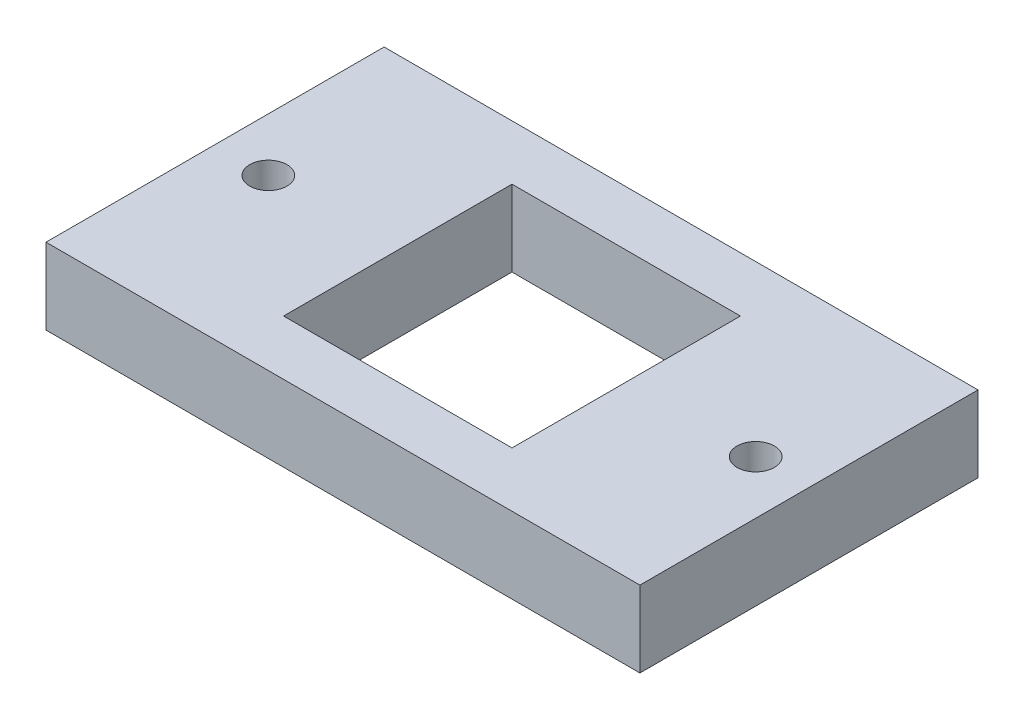
ISO-10303-21;
HEADER;
FILE_DESCRIPTION(('STEP AP214'),'2;1');
FILE_NAME('part.step','',(''),(''),'','','');
FILE_SCHEMA(('AUTOMOTIVE_DESIGN { 1 0 10303 214 1 1 1 1 }'));
ENDSEC;
DATA;
#1=APPLICATION_CONTEXT('core data for automotive mechanical design processes');
#2=APPLICATION_PROTOCOL_DEFINITION('international standard','automotive_design',2000,#1);
#3=PRODUCT_CONTEXT('',#1,'mechanical');
#4=PRODUCT('Part','Part','',(#3));
#5=PRODUCT_RELATED_PRODUCT_CATEGORY('part','',(#4));
#6=PRODUCT_DEFINITION_FORMATION('','',#4);
#7=PRODUCT_DEFINITION_CONTEXT('part definition',#1,'design');
#8=PRODUCT_DEFINITION('design','',#6,#7);
#9=PRODUCT_DEFINITION_SHAPE('','',#8);
#10=(LENGTH_UNIT() NAMED_UNIT(*) SI_UNIT(.MILLI.,.METRE.));
#11=(NAMED_UNIT(*) PLANE_ANGLE_UNIT() SI_UNIT($,.RADIAN.));
#12=(NAMED_UNIT(*) SI_UNIT($,.STERADIAN.) SOLID_ANGLE_UNIT());
#13=UNCERTAINTY_MEASURE_WITH_UNIT(LENGTH_MEASURE(1.E-05),#10,'distance_accuracy_value','');
#14=(GEOMETRIC_REPRESENTATION_CONTEXT(3) GLOBAL_UNCERTAINTY_ASSIGNED_CONTEXT((#13)) GLOBAL_UNIT_ASSIGNED_CONTEXT((#10,
#11,#12)) REPRESENTATION_CONTEXT('',''));
#15=CARTESIAN_POINT('',(0.,0.,0.));
#16=DIRECTION('',(0.,0.,1.));
#17=DIRECTION('',(1.,0.,0.));
#18=AXIS2_PLACEMENT_3D('',#15,#16,#17);
#19=CARTESIAN_POINT('',(0.,5.,0.));
#20=DIRECTION('',(0.,1.,0.));
#21=DIRECTION('',(0.,0.,1.));
#22=AXIS2_PLACEMENT_3D('',#19,#20,#21);
#23=PLANE('',#22);
#24=CARTESIAN_POINT('',(-52.1969845232262,5.,-19.655669648162));
#25=DIRECTION('',(0.,1.,0.));
#26=DIRECTION('',(0.,0.,1.));
#27=AXIS2_PLACEMENT_3D('',#24,#25,#26);
#28=CIRCLE('',#27,1.225);
#29=CARTESIAN_POINT('',(-52.1969845232262,5.,-18.430669648162));
#30=VERTEX_POINT('',#29);
#31=EDGE_CURVE('E139',#30,#30,#28,.T.);
#32=ORIENTED_EDGE('',*,*,#31,.F.);
#33=EDGE_LOOP('',(#32));
#34=FACE_BOUND('',#33,.T.);
#35=DIRECTION('',(0.,0.,1.));
#36=VECTOR('',#35,1.);
#37=CARTESIAN_POINT('',(-55.6969845232263,5.,-30.755669648162));
#38=LINE('',#37,#36);
#39=CARTESIAN_POINT('',(-55.6969845232263,5.,-30.755669648162));
#40=VERTEX_POINT('',#39);
#41=CARTESIAN_POINT('',(-55.6969845232263,5.,-8.55566964816199));
#42=VERTEX_POINT('',#41);
#43=EDGE_CURVE('E155',#40,#42,#38,.T.);
#44=ORIENTED_EDGE('',*,*,#43,.T.);
#45=DIRECTION('',(1.,0.,0.));
#46=VECTOR('',#45,1.);
#47=CARTESIAN_POINT('',(-55.6969845232263,5.,-8.55566964816199));
#48=LINE('',#47,#46);
#49=CARTESIAN_POINT('',(-16.6969845232262,5.,-8.55566964816199));
#50=VERTEX_POINT('',#49);
#51=EDGE_CURVE('E159',#42,#50,#48,.T.);
#52=ORIENTED_EDGE('',*,*,#51,.T.);
#53=DIRECTION('',(0.,0.,-1.));
#54=VECTOR('',#53,1.);
#55=CARTESIAN_POINT('',(-16.6969845232262,5.,-30.755669648162));
#56=LINE('',#55,#54);
#57=CARTESIAN_POINT('',(-16.6969845232262,5.,-30.755669648162));
#58=VERTEX_POINT('',#57);
#59=EDGE_CURVE('E163',#50,#58,#56,.T.);
#60=ORIENTED_EDGE('',*,*,#59,.T.);
#61=DIRECTION('',(-1.,0.,0.));
#62=VECTOR('',#61,1.);
#63=CARTESIAN_POINT('',(-55.6969845232263,5.,-30.755669648162));
#64=LINE('',#63,#62);
#65=EDGE_CURVE('E166',#58,#40,#64,.T.);
#66=ORIENTED_EDGE('',*,*,#65,.T.);
#67=EDGE_LOOP('',(#44,#52,#60,#66));
#68=FACE_BOUND('',#67,.T.);
#69=DIRECTION('',(1.,0.,0.));
#70=VECTOR('',#69,1.);
#71=CARTESIAN_POINT('',(-43.6969845232262,5.,-12.155669648162));
#72=LINE('',#71,#70);
#73=CARTESIAN_POINT('',(-43.6969845232262,5.,-12.155669648162));
#74=VERTEX_POINT('',#73);
#75=CARTESIAN_POINT('',(-28.6969845232262,5.,-12.155669648162));
#76=VERTEX_POINT('',#75);
#77=EDGE_CURVE('E113',#74,#76,#72,.T.);
#78=ORIENTED_EDGE('',*,*,#77,.F.);
#79=DIRECTION('',(0.,0.,1.));
#80=VECTOR('',#79,1.);
#81=CARTESIAN_POINT('',(-43.6969845232262,5.,-27.155669648162));
#82=LINE('',#81,#80);
#83=CARTESIAN_POINT('',(-43.6969845232262,5.,-27.155669648162));
#84=VERTEX_POINT('',#83);
#85=EDGE_CURVE('E104',#84,#74,#82,.T.);
#86=ORIENTED_EDGE('',*,*,#85,.F.);
#87=DIRECTION('',(-1.,0.,0.));
#88=VECTOR('',#87,1.);
#89=CARTESIAN_POINT('',(-43.6969845232262,5.,-27.155669648162));
#90=LINE('',#89,#88);
#91=CARTESIAN_POINT('',(-28.6969845232262,5.,-27.155669648162));
#92=VERTEX_POINT('',#91);
#93=EDGE_CURVE('E131',#92,#84,#90,.T.);
#94=ORIENTED_EDGE('',*,*,#93,.F.);
#95=DIRECTION('',(0.,0.,-1.));
#96=VECTOR('',#95,1.);
#97=CARTESIAN_POINT('',(-28.6969845232262,5.,-27.155669648162));
#98=LINE('',#97,#96);
#99=EDGE_CURVE('E127',#76,#92,#98,.T.);
#100=ORIENTED_EDGE('',*,*,#99,.F.);
#101=EDGE_LOOP('',(#78,#86,#94,#100));
#102=FACE_BOUND('',#101,.T.);
#103=CARTESIAN_POINT('',(-20.1969845232262,5.,-19.655669648162));
#104=DIRECTION('',(0.,1.,0.));
#105=DIRECTION('',(0.,0.,1.));
#106=AXIS2_PLACEMENT_3D('',#103,#104,#105);
#107=CIRCLE('',#106,1.225);
#108=CARTESIAN_POINT('',(-20.1969845232262,5.,-18.430669648162));
#109=VERTEX_POINT('',#108);
#110=EDGE_CURVE('E256',#109,#109,#107,.T.);
#111=ORIENTED_EDGE('',*,*,#110,.F.);
#112=EDGE_LOOP('',(#111));
#113=FACE_BOUND('',#112,.T.);
#114=ADVANCED_FACE('F38',(#34,#68,#102,#113),#23,.T.);
#115=CARTESIAN_POINT('',(0.,0.,0.));
#116=DIRECTION('',(0.,1.,0.));
#117=DIRECTION('',(0.,0.,1.));
#118=AXIS2_PLACEMENT_3D('',#115,#116,#117);
#119=PLANE('',#118);
#120=DIRECTION('',(0.,0.,1.));
#121=VECTOR('',#120,1.);
#122=CARTESIAN_POINT('',(-55.6969845232263,0.,-30.755669648162));
#123=LINE('',#122,#121);
#124=CARTESIAN_POINT('',(-55.6969845232263,0.,-30.755669648162));
#125=VERTEX_POINT('',#124);
#126=CARTESIAN_POINT('',(-55.6969845232263,0.,-8.55566964816199));
#127=VERTEX_POINT('',#126);
#128=EDGE_CURVE('E122',#125,#127,#123,.T.);
#129=ORIENTED_EDGE('',*,*,#128,.F.);
#130=DIRECTION('',(-1.,0.,0.));
#131=VECTOR('',#130,1.);
#132=CARTESIAN_POINT('',(-55.6969845232263,0.,-30.755669648162));
#133=LINE('',#132,#131);
#134=CARTESIAN_POINT('',(-16.6969845232262,0.,-30.755669648162));
#135=VERTEX_POINT('',#134);
#136=EDGE_CURVE('E160',#135,#125,#133,.T.);
#137=ORIENTED_EDGE('',*,*,#136,.F.);
#138=DIRECTION('',(0.,0.,-1.));
#139=VECTOR('',#138,1.);
#140=CARTESIAN_POINT('',(-16.6969845232262,0.,-30.755669648162));
#141=LINE('',#140,#139);
#142=CARTESIAN_POINT('',(-16.6969845232262,0.,-8.55566964816199));
#143=VERTEX_POINT('',#142);
#144=EDGE_CURVE('E176',#143,#135,#141,.T.);
#145=ORIENTED_EDGE('',*,*,#144,.F.);
#146=DIRECTION('',(1.,0.,0.));
#147=VECTOR('',#146,1.);
#148=CARTESIAN_POINT('',(-55.6969845232263,0.,-8.55566964816199));
#149=LINE('',#148,#147);
#150=EDGE_CURVE('E173',#127,#143,#149,.T.);
#151=ORIENTED_EDGE('',*,*,#150,.F.);
#152=EDGE_LOOP('',(#129,#137,#145,#151));
#153=FACE_BOUND('',#152,.T.);
#154=DIRECTION('',(0.,0.,1.));
#155=VECTOR('',#154,1.);
#156=CARTESIAN_POINT('',(-43.6969845232262,0.,-27.155669648162));
#157=LINE('',#156,#155);
#158=CARTESIAN_POINT('',(-43.6969845232262,0.,-27.155669648162));
#159=VERTEX_POINT('',#158);
#160=CARTESIAN_POINT('',(-43.6969845232262,0.,-12.155669648162));
#161=VERTEX_POINT('',#160);
#162=EDGE_CURVE('E62',#159,#161,#157,.T.);
#163=ORIENTED_EDGE('',*,*,#162,.T.);
#164=DIRECTION('',(1.,0.,0.));
#165=VECTOR('',#164,1.);
#166=CARTESIAN_POINT('',(-43.6969845232262,0.,-12.155669648162));
#167=LINE('',#166,#165);
#168=CARTESIAN_POINT('',(-28.6969845232262,0.,-12.155669648162));
#169=VERTEX_POINT('',#168);
#170=EDGE_CURVE('E120',#161,#169,#167,.T.);
#171=ORIENTED_EDGE('',*,*,#170,.T.);
#172=DIRECTION('',(0.,0.,-1.));
#173=VECTOR('',#172,1.);
#174=CARTESIAN_POINT('',(-28.6969845232262,0.,-27.155669648162));
#175=LINE('',#174,#173);
#176=CARTESIAN_POINT('',(-28.6969845232262,0.,-27.155669648162));
#177=VERTEX_POINT('',#176);
#178=EDGE_CURVE('E142',#169,#177,#175,.T.);
#179=ORIENTED_EDGE('',*,*,#178,.T.);
#180=DIRECTION('',(-1.,0.,0.));
#181=VECTOR('',#180,1.);
#182=CARTESIAN_POINT('',(-43.6969845232262,0.,-27.155669648162));
#183=LINE('',#182,#181);
#184=EDGE_CURVE('E114',#177,#159,#183,.T.);
#185=ORIENTED_EDGE('',*,*,#184,.T.);
#186=EDGE_LOOP('',(#163,#171,#179,#185));
#187=FACE_BOUND('',#186,.T.);
#188=CARTESIAN_POINT('',(-52.1969845232262,0.,-19.655669648162));
#189=DIRECTION('',(0.,1.,0.));
#190=DIRECTION('',(0.,0.,1.));
#191=AXIS2_PLACEMENT_3D('',#188,#189,#190);
#192=CIRCLE('',#191,1.225);
#193=CARTESIAN_POINT('',(-52.1969845232262,0.,-18.430669648162));
#194=VERTEX_POINT('',#193);
#195=EDGE_CURVE('E264',#194,#194,#192,.T.);
#196=ORIENTED_EDGE('',*,*,#195,.T.);
#197=EDGE_LOOP('',(#196));
#198=FACE_BOUND('',#197,.T.);
#199=CARTESIAN_POINT('',(-20.1969845232262,0.,-19.655669648162));
#200=DIRECTION('',(0.,1.,0.));
#201=DIRECTION('',(0.,0.,1.));
#202=AXIS2_PLACEMENT_3D('',#199,#200,#201);
#203=CIRCLE('',#202,1.225);
#204=CARTESIAN_POINT('',(-20.1969845232262,0.,-18.430669648162));
#205=VERTEX_POINT('',#204);
#206=EDGE_CURVE('E259',#205,#205,#203,.T.);
#207=ORIENTED_EDGE('',*,*,#206,.T.);
#208=EDGE_LOOP('',(#207));
#209=FACE_BOUND('',#208,.T.);
#210=ADVANCED_FACE('F199',(#153,#187,#198,#209),#119,.F.);
#211=CARTESIAN_POINT('',(-55.6969845232263,5.,-30.755669648162));
#212=DIRECTION('',(1.,0.,0.));
#213=DIRECTION('',(0.,0.,-1.));
#214=AXIS2_PLACEMENT_3D('',#211,#212,#213);
#215=PLANE('',#214);
#216=ORIENTED_EDGE('',*,*,#128,.T.);
#217=DIRECTION('',(0.,-1.,0.));
#218=VECTOR('',#217,1.);
#219=CARTESIAN_POINT('',(-55.6969845232263,5.,-8.55566964816199));
#220=LINE('',#219,#218);
#221=EDGE_CURVE('E11',#42,#127,#220,.T.);
#222=ORIENTED_EDGE('',*,*,#221,.F.);
#223=ORIENTED_EDGE('',*,*,#43,.F.);
#224=DIRECTION('',(0.,-1.,0.));
#225=VECTOR('',#224,1.);
#226=CARTESIAN_POINT('',(-55.6969845232263,5.,-30.755669648162));
#227=LINE('',#226,#225);
#228=EDGE_CURVE('E169',#40,#125,#227,.T.);
#229=ORIENTED_EDGE('',*,*,#228,.T.);
#230=EDGE_LOOP('',(#216,#222,#223,#229));
#231=FACE_BOUND('',#230,.T.);
#232=ADVANCED_FACE('F40',(#231),#215,.F.);
#233=CARTESIAN_POINT('',(-55.6969845232263,5.,-8.55566964816199));
#234=DIRECTION('',(0.,0.,-1.));
#235=DIRECTION('',(-1.,0.,0.));
#236=AXIS2_PLACEMENT_3D('',#233,#234,#235);
#237=PLANE('',#236);
#238=ORIENTED_EDGE('',*,*,#150,.T.);
#239=DIRECTION('',(0.,-1.,0.));
#240=VECTOR('',#239,1.);
#241=CARTESIAN_POINT('',(-16.6969845232262,5.,-8.55566964816199));
#242=LINE('',#241,#240);
#243=EDGE_CURVE('E47',#50,#143,#242,.T.);
#244=ORIENTED_EDGE('',*,*,#243,.F.);
#245=ORIENTED_EDGE('',*,*,#51,.F.);
#246=ORIENTED_EDGE('',*,*,#221,.T.);
#247=EDGE_LOOP('',(#238,#244,#245,#246));
#248=FACE_BOUND('',#247,.T.);
#249=ADVANCED_FACE('F209',(#248),#237,.F.);
#250=CARTESIAN_POINT('',(-16.6969845232262,5.,-30.755669648162));
#251=DIRECTION('',(-1.,0.,0.));
#252=DIRECTION('',(0.,0.,1.));
#253=AXIS2_PLACEMENT_3D('',#250,#251,#252);
#254=PLANE('',#253);
#255=ORIENTED_EDGE('',*,*,#144,.T.);
#256=DIRECTION('',(0.,-1.,0.));
#257=VECTOR('',#256,1.);
#258=CARTESIAN_POINT('',(-16.6969845232262,5.,-30.755669648162));
#259=LINE('',#258,#257);
#260=EDGE_CURVE('E184',#58,#135,#259,.T.);
#261=ORIENTED_EDGE('',*,*,#260,.F.);
#262=ORIENTED_EDGE('',*,*,#59,.F.);
#263=ORIENTED_EDGE('',*,*,#243,.T.);
#264=EDGE_LOOP('',(#255,#261,#262,#263));
#265=FACE_BOUND('',#264,.T.);
#266=ADVANCED_FACE('F193',(#265),#254,.F.);
#267=CARTESIAN_POINT('',(-55.6969845232263,5.,-30.755669648162));
#268=DIRECTION('',(0.,0.,1.));
#269=DIRECTION('',(1.,0.,0.));
#270=AXIS2_PLACEMENT_3D('',#267,#268,#269);
#271=PLANE('',#270);
#272=ORIENTED_EDGE('',*,*,#136,.T.);
#273=ORIENTED_EDGE('',*,*,#228,.F.);
#274=ORIENTED_EDGE('',*,*,#65,.F.);
#275=ORIENTED_EDGE('',*,*,#260,.T.);
#276=EDGE_LOOP('',(#272,#273,#274,#275));
#277=FACE_BOUND('',#276,.T.);
#278=ADVANCED_FACE('F203',(#277),#271,.F.);
#279=CARTESIAN_POINT('',(-43.6969845232262,5.,-27.155669648162));
#280=DIRECTION('',(1.,0.,0.));
#281=DIRECTION('',(0.,0.,-1.));
#282=AXIS2_PLACEMENT_3D('',#279,#280,#281);
#283=PLANE('',#282);
#284=ORIENTED_EDGE('',*,*,#162,.F.);
#285=DIRECTION('',(0.,-1.,0.));
#286=VECTOR('',#285,1.);
#287=CARTESIAN_POINT('',(-43.6969845232262,5.,-27.155669648162));
#288=LINE('',#287,#286);
#289=EDGE_CURVE('E108',#84,#159,#288,.T.);
#290=ORIENTED_EDGE('',*,*,#289,.F.);
#291=ORIENTED_EDGE('',*,*,#85,.T.);
#292=DIRECTION('',(0.,-1.,0.));
#293=VECTOR('',#292,1.);
#294=CARTESIAN_POINT('',(-43.6969845232262,5.,-12.155669648162));
#295=LINE('',#294,#293);
#296=EDGE_CURVE('E107',#74,#161,#295,.T.);
#297=ORIENTED_EDGE('',*,*,#296,.T.);
#298=EDGE_LOOP('',(#284,#290,#291,#297));
#299=FACE_BOUND('',#298,.T.);
#300=ADVANCED_FACE('F106',(#299),#283,.T.);
#301=CARTESIAN_POINT('',(-43.6969845232262,5.,-12.155669648162));
#302=DIRECTION('',(0.,0.,-1.));
#303=DIRECTION('',(-1.,0.,0.));
#304=AXIS2_PLACEMENT_3D('',#301,#302,#303);
#305=PLANE('',#304);
#306=ORIENTED_EDGE('',*,*,#170,.F.);
#307=ORIENTED_EDGE('',*,*,#296,.F.);
#308=ORIENTED_EDGE('',*,*,#77,.T.);
#309=DIRECTION('',(0.,-1.,0.));
#310=VECTOR('',#309,1.);
#311=CARTESIAN_POINT('',(-28.6969845232262,5.,-12.155669648162));
#312=LINE('',#311,#310);
#313=EDGE_CURVE('E123',#76,#169,#312,.T.);
#314=ORIENTED_EDGE('',*,*,#313,.T.);
#315=EDGE_LOOP('',(#306,#307,#308,#314));
#316=FACE_BOUND('',#315,.T.);
#317=ADVANCED_FACE('F117',(#316),#305,.T.);
#318=CARTESIAN_POINT('',(-28.6969845232262,5.,-27.155669648162));
#319=DIRECTION('',(-1.,0.,0.));
#320=DIRECTION('',(0.,0.,1.));
#321=AXIS2_PLACEMENT_3D('',#318,#319,#320);
#322=PLANE('',#321);
#323=ORIENTED_EDGE('',*,*,#178,.F.);
#324=ORIENTED_EDGE('',*,*,#313,.F.);
#325=ORIENTED_EDGE('',*,*,#99,.T.);
#326=DIRECTION('',(0.,-1.,0.));
#327=VECTOR('',#326,1.);
#328=CARTESIAN_POINT('',(-28.6969845232262,5.,-27.155669648162));
#329=LINE('',#328,#327);
#330=EDGE_CURVE('E54',#92,#177,#329,.T.);
#331=ORIENTED_EDGE('',*,*,#330,.T.);
#332=EDGE_LOOP('',(#323,#324,#325,#331));
#333=FACE_BOUND('',#332,.T.);
#334=ADVANCED_FACE('F234',(#333),#322,.T.);
#335=CARTESIAN_POINT('',(-43.6969845232262,5.,-27.155669648162));
#336=DIRECTION('',(0.,0.,1.));
#337=DIRECTION('',(1.,0.,0.));
#338=AXIS2_PLACEMENT_3D('',#335,#336,#337);
#339=PLANE('',#338);
#340=ORIENTED_EDGE('',*,*,#184,.F.);
#341=ORIENTED_EDGE('',*,*,#330,.F.);
#342=ORIENTED_EDGE('',*,*,#93,.T.);
#343=ORIENTED_EDGE('',*,*,#289,.T.);
#344=EDGE_LOOP('',(#340,#341,#342,#343));
#345=FACE_BOUND('',#344,.T.);
#346=ADVANCED_FACE('F238',(#345),#339,.T.);
#347=CARTESIAN_POINT('',(-52.1969845232262,5.,-19.655669648162));
#348=DIRECTION('',(0.,-1.,0.));
#349=DIRECTION('',(0.,0.,-1.));
#350=AXIS2_PLACEMENT_3D('',#347,#348,#349);
#351=CYLINDRICAL_SURFACE('',#350,1.225);
#352=ORIENTED_EDGE('',*,*,#31,.T.);
#353=EDGE_LOOP('',(#352));
#354=FACE_BOUND('',#353,.T.);
#355=ORIENTED_EDGE('',*,*,#195,.F.);
#356=EDGE_LOOP('',(#355));
#357=FACE_BOUND('',#356,.T.);
#358=ADVANCED_FACE('F244',(#354,#357),#351,.F.);
#359=CARTESIAN_POINT('',(-20.1969845232262,5.,-19.655669648162));
#360=DIRECTION('',(0.,-1.,0.));
#361=DIRECTION('',(0.,0.,-1.));
#362=AXIS2_PLACEMENT_3D('',#359,#360,#361);
#363=CYLINDRICAL_SURFACE('',#362,1.225);
#364=ORIENTED_EDGE('',*,*,#110,.T.);
#365=EDGE_LOOP('',(#364));
#366=FACE_BOUND('',#365,.T.);
#367=ORIENTED_EDGE('',*,*,#206,.F.);
#368=EDGE_LOOP('',(#367));
#369=FACE_BOUND('',#368,.T.);
#370=ADVANCED_FACE('F247',(#366,#369),#363,.F.);
#371=CLOSED_SHELL('',(#114,#210,#232,#249,#266,#278,#300,#317,#334,#346,#358,#370));
#372=MANIFOLD_SOLID_BREP('B2',#371);
#373=ADVANCED_BREP_SHAPE_REPRESENTATION('',(#18,#372),#14);
#374=SHAPE_DEFINITION_REPRESENTATION(#9,#373);
ENDSEC;
END-ISO-10303-21;
